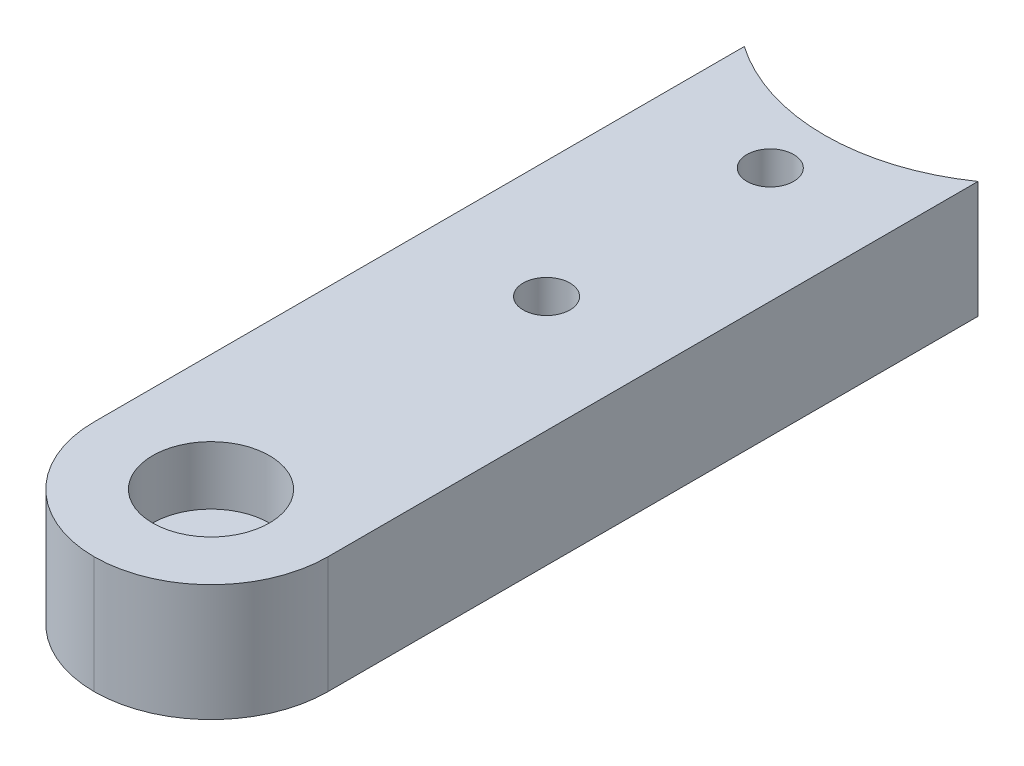
ISO-10303-21;
HEADER;
FILE_DESCRIPTION(('STEP AP214'),'2;1');
FILE_NAME('part.step','',(''),(''),'','','');
FILE_SCHEMA(('AUTOMOTIVE_DESIGN { 1 0 10303 214 1 1 1 1 }'));
ENDSEC;
DATA;
#1=APPLICATION_CONTEXT('core data for automotive mechanical design processes');
#2=APPLICATION_PROTOCOL_DEFINITION('international standard','automotive_design',2000,#1);
#3=PRODUCT_CONTEXT('',#1,'mechanical');
#4=PRODUCT('Part','Part','',(#3));
#5=PRODUCT_RELATED_PRODUCT_CATEGORY('part','',(#4));
#6=PRODUCT_DEFINITION_FORMATION('','',#4);
#7=PRODUCT_DEFINITION_CONTEXT('part definition',#1,'design');
#8=PRODUCT_DEFINITION('design','',#6,#7);
#9=PRODUCT_DEFINITION_SHAPE('','',#8);
#10=(LENGTH_UNIT() NAMED_UNIT(*) SI_UNIT(.MILLI.,.METRE.));
#11=(NAMED_UNIT(*) PLANE_ANGLE_UNIT() SI_UNIT($,.RADIAN.));
#12=(NAMED_UNIT(*) SI_UNIT($,.STERADIAN.) SOLID_ANGLE_UNIT());
#13=UNCERTAINTY_MEASURE_WITH_UNIT(LENGTH_MEASURE(1.E-05),#10,'distance_accuracy_value','');
#14=(GEOMETRIC_REPRESENTATION_CONTEXT(3) GLOBAL_UNCERTAINTY_ASSIGNED_CONTEXT((#13)) GLOBAL_UNIT_ASSIGNED_CONTEXT((#10,
#11,#12)) REPRESENTATION_CONTEXT('',''));
#15=CARTESIAN_POINT('',(0.,0.,0.));
#16=DIRECTION('',(0.,0.,1.));
#17=DIRECTION('',(1.,0.,0.));
#18=AXIS2_PLACEMENT_3D('',#15,#16,#17);
#19=CARTESIAN_POINT('',(2.,0.,13.));
#20=DIRECTION('',(0.,1.,0.));
#21=DIRECTION('',(0.,0.,1.));
#22=AXIS2_PLACEMENT_3D('',#19,#20,#21);
#23=CYLINDRICAL_SURFACE('',#22,0.4);
#24=CARTESIAN_POINT('',(2.,0.,13.));
#25=DIRECTION('',(0.,1.,0.));
#26=DIRECTION('',(0.,0.,1.));
#27=AXIS2_PLACEMENT_3D('',#24,#25,#26);
#28=CIRCLE('',#27,0.4);
#29=CARTESIAN_POINT('',(2.,0.,13.4));
#30=VERTEX_POINT('',#29);
#31=EDGE_CURVE('E155',#30,#30,#28,.T.);
#32=ORIENTED_EDGE('',*,*,#31,.F.);
#33=EDGE_LOOP('',(#32));
#34=FACE_BOUND('',#33,.T.);
#35=CARTESIAN_POINT('',(2.,1.,13.));
#36=DIRECTION('',(0.,1.,0.));
#37=DIRECTION('',(0.,0.,1.));
#38=AXIS2_PLACEMENT_3D('',#35,#36,#37);
#39=CIRCLE('',#38,0.4);
#40=CARTESIAN_POINT('',(2.,1.,13.4));
#41=VERTEX_POINT('',#40);
#42=EDGE_CURVE('E144',#41,#41,#39,.F.);
#43=ORIENTED_EDGE('',*,*,#42,.F.);
#44=EDGE_LOOP('',(#43));
#45=FACE_BOUND('',#44,.T.);
#46=ADVANCED_FACE('F43',(#34,#45),#23,.F.);
#47=CARTESIAN_POINT('',(4.,2.,0.));
#48=DIRECTION('',(1.,0.,0.));
#49=DIRECTION('',(0.,0.,-1.));
#50=AXIS2_PLACEMENT_3D('',#47,#48,#49);
#51=PLANE('',#50);
#52=DIRECTION('',(0.,0.,1.));
#53=VECTOR('',#52,1.);
#54=CARTESIAN_POINT('',(4.,2.,0.));
#55=LINE('',#54,#53);
#56=CARTESIAN_POINT('',(4.,2.,1.87228132326902));
#57=VERTEX_POINT('',#56);
#58=CARTESIAN_POINT('',(4.,2.,13.));
#59=VERTEX_POINT('',#58);
#60=EDGE_CURVE('E111',#57,#59,#55,.T.);
#61=ORIENTED_EDGE('',*,*,#60,.T.);
#62=DIRECTION('',(0.,-1.,0.));
#63=VECTOR('',#62,1.);
#64=CARTESIAN_POINT('',(4.,0.,13.));
#65=LINE('',#64,#63);
#66=CARTESIAN_POINT('',(4.,0.,13.));
#67=VERTEX_POINT('',#66);
#68=EDGE_CURVE('E101',#59,#67,#65,.T.);
#69=ORIENTED_EDGE('',*,*,#68,.T.);
#70=DIRECTION('',(0.,0.,1.));
#71=VECTOR('',#70,1.);
#72=CARTESIAN_POINT('',(4.,0.,0.));
#73=LINE('',#72,#71);
#74=CARTESIAN_POINT('',(4.,0.,1.87228132326902));
#75=VERTEX_POINT('',#74);
#76=EDGE_CURVE('E112',#75,#67,#73,.T.);
#77=ORIENTED_EDGE('',*,*,#76,.F.);
#78=DIRECTION('',(0.,1.,0.));
#79=VECTOR('',#78,1.);
#80=CARTESIAN_POINT('',(4.,0.,1.87228132326902));
#81=LINE('',#80,#79);
#82=EDGE_CURVE('E96',#57,#75,#81,.F.);
#83=ORIENTED_EDGE('',*,*,#82,.F.);
#84=EDGE_LOOP('',(#61,#69,#77,#83));
#85=FACE_BOUND('',#84,.T.);
#86=ADVANCED_FACE('F134',(#85),#51,.T.);
#87=CARTESIAN_POINT('',(0.,2.,0.));
#88=DIRECTION('',(1.,0.,0.));
#89=DIRECTION('',(0.,0.,-1.));
#90=AXIS2_PLACEMENT_3D('',#87,#88,#89);
#91=PLANE('',#90);
#92=DIRECTION('',(0.,0.,1.));
#93=VECTOR('',#92,1.);
#94=CARTESIAN_POINT('',(0.,0.,0.));
#95=LINE('',#94,#93);
#96=CARTESIAN_POINT('',(0.,0.,1.87228132326901));
#97=VERTEX_POINT('',#96);
#98=CARTESIAN_POINT('',(0.,0.,13.));
#99=VERTEX_POINT('',#98);
#100=EDGE_CURVE('E105',#97,#99,#95,.T.);
#101=ORIENTED_EDGE('',*,*,#100,.T.);
#102=DIRECTION('',(0.,-1.,0.));
#103=VECTOR('',#102,1.);
#104=CARTESIAN_POINT('',(0.,2.,13.));
#105=LINE('',#104,#103);
#106=CARTESIAN_POINT('',(0.,2.,13.));
#107=VERTEX_POINT('',#106);
#108=EDGE_CURVE('E12',#99,#107,#105,.F.);
#109=ORIENTED_EDGE('',*,*,#108,.T.);
#110=DIRECTION('',(0.,0.,1.));
#111=VECTOR('',#110,1.);
#112=CARTESIAN_POINT('',(0.,2.,0.));
#113=LINE('',#112,#111);
#114=CARTESIAN_POINT('',(0.,2.,1.87228132326901));
#115=VERTEX_POINT('',#114);
#116=EDGE_CURVE('E102',#115,#107,#113,.T.);
#117=ORIENTED_EDGE('',*,*,#116,.F.);
#118=DIRECTION('',(0.,1.,0.));
#119=VECTOR('',#118,1.);
#120=CARTESIAN_POINT('',(0.,0.,1.87228132326901));
#121=LINE('',#120,#119);
#122=EDGE_CURVE('E93',#115,#97,#121,.F.);
#123=ORIENTED_EDGE('',*,*,#122,.T.);
#124=EDGE_LOOP('',(#101,#109,#117,#123));
#125=FACE_BOUND('',#124,.T.);
#126=ADVANCED_FACE('F104',(#125),#91,.F.);
#127=CARTESIAN_POINT('',(0.,2.,0.));
#128=DIRECTION('',(0.,1.,0.));
#129=DIRECTION('',(0.,0.,1.));
#130=AXIS2_PLACEMENT_3D('',#127,#128,#129);
#131=PLANE('',#130);
#132=CARTESIAN_POINT('',(2.,2.,13.));
#133=DIRECTION('',(0.,1.,0.));
#134=DIRECTION('',(0.,0.,1.));
#135=AXIS2_PLACEMENT_3D('',#132,#133,#134);
#136=CIRCLE('',#135,2.);
#137=CARTESIAN_POINT('',(2.,2.,15.));
#138=VERTEX_POINT('',#137);
#139=EDGE_CURVE('E59',#107,#138,#136,.T.);
#140=ORIENTED_EDGE('',*,*,#139,.T.);
#141=CARTESIAN_POINT('',(2.,2.,13.));
#142=DIRECTION('',(0.,1.,0.));
#143=DIRECTION('',(0.,0.,1.));
#144=AXIS2_PLACEMENT_3D('',#141,#142,#143);
#145=CIRCLE('',#144,2.);
#146=EDGE_CURVE('E52',#138,#59,#145,.T.);
#147=ORIENTED_EDGE('',*,*,#146,.T.);
#148=ORIENTED_EDGE('',*,*,#60,.F.);
#149=CARTESIAN_POINT('',(2.,2.,-1.));
#150=DIRECTION('',(0.,1.,0.));
#151=DIRECTION('',(0.,0.,1.));
#152=AXIS2_PLACEMENT_3D('',#149,#150,#151);
#153=CIRCLE('',#152,3.5);
#154=EDGE_CURVE('E106',#115,#57,#153,.T.);
#155=ORIENTED_EDGE('',*,*,#154,.F.);
#156=ORIENTED_EDGE('',*,*,#116,.T.);
#157=EDGE_LOOP('',(#140,#147,#148,#155,#156));
#158=FACE_BOUND('',#157,.T.);
#159=CARTESIAN_POINT('',(2.,2.,13.));
#160=DIRECTION('',(0.,1.,0.));
#161=DIRECTION('',(0.,0.,1.));
#162=AXIS2_PLACEMENT_3D('',#159,#160,#161);
#163=CIRCLE('',#162,1.);
#164=CARTESIAN_POINT('',(2.,2.,14.));
#165=VERTEX_POINT('',#164);
#166=EDGE_CURVE('E140',#165,#165,#163,.T.);
#167=ORIENTED_EDGE('',*,*,#166,.F.);
#168=EDGE_LOOP('',(#167));
#169=FACE_BOUND('',#168,.T.);
#170=CARTESIAN_POINT('',(2.022495613113,2.,3.45002649493755));
#171=DIRECTION('',(0.,1.,0.));
#172=DIRECTION('',(0.,0.,1.));
#173=AXIS2_PLACEMENT_3D('',#170,#171,#172);
#174=CIRCLE('',#173,0.4);
#175=CARTESIAN_POINT('',(2.022495613113,2.,3.85002649493756));
#176=VERTEX_POINT('',#175);
#177=EDGE_CURVE('E152',#176,#176,#174,.T.);
#178=ORIENTED_EDGE('',*,*,#177,.F.);
#179=EDGE_LOOP('',(#178));
#180=FACE_BOUND('',#179,.T.);
#181=CARTESIAN_POINT('',(2.01349736786792,2.,7.27001589696245));
#182=DIRECTION('',(0.,1.,0.));
#183=DIRECTION('',(0.,0.,1.));
#184=AXIS2_PLACEMENT_3D('',#181,#182,#183);
#185=CIRCLE('',#184,0.4);
#186=CARTESIAN_POINT('',(2.01349736786792,2.,7.67001589696245));
#187=VERTEX_POINT('',#186);
#188=EDGE_CURVE('E158',#187,#187,#185,.T.);
#189=ORIENTED_EDGE('',*,*,#188,.F.);
#190=EDGE_LOOP('',(#189));
#191=FACE_BOUND('',#190,.T.);
#192=ADVANCED_FACE('F128',(#158,#169,#180,#191),#131,.T.);
#193=CARTESIAN_POINT('',(0.,0.,0.));
#194=DIRECTION('',(0.,1.,0.));
#195=DIRECTION('',(0.,0.,1.));
#196=AXIS2_PLACEMENT_3D('',#193,#194,#195);
#197=PLANE('',#196);
#198=CARTESIAN_POINT('',(2.022495613113,0.,3.45002649493755));
#199=DIRECTION('',(0.,1.,0.));
#200=DIRECTION('',(0.,0.,1.));
#201=AXIS2_PLACEMENT_3D('',#198,#199,#200);
#202=CIRCLE('',#201,0.4);
#203=CARTESIAN_POINT('',(2.022495613113,0.,3.85002649493756));
#204=VERTEX_POINT('',#203);
#205=EDGE_CURVE('E116',#204,#204,#202,.T.);
#206=ORIENTED_EDGE('',*,*,#205,.T.);
#207=EDGE_LOOP('',(#206));
#208=FACE_BOUND('',#207,.T.);
#209=ORIENTED_EDGE('',*,*,#31,.T.);
#210=EDGE_LOOP('',(#209));
#211=FACE_BOUND('',#210,.T.);
#212=CARTESIAN_POINT('',(2.01349736786792,0.,7.27001589696245));
#213=DIRECTION('',(0.,1.,0.));
#214=DIRECTION('',(0.,0.,1.));
#215=AXIS2_PLACEMENT_3D('',#212,#213,#214);
#216=CIRCLE('',#215,0.4);
#217=CARTESIAN_POINT('',(2.01349736786792,0.,7.67001589696245));
#218=VERTEX_POINT('',#217);
#219=EDGE_CURVE('E149',#218,#218,#216,.T.);
#220=ORIENTED_EDGE('',*,*,#219,.T.);
#221=EDGE_LOOP('',(#220));
#222=FACE_BOUND('',#221,.T.);
#223=ORIENTED_EDGE('',*,*,#76,.T.);
#224=CARTESIAN_POINT('',(2.,0.,13.));
#225=DIRECTION('',(0.,1.,0.));
#226=DIRECTION('',(0.,0.,1.));
#227=AXIS2_PLACEMENT_3D('',#224,#225,#226);
#228=CIRCLE('',#227,2.);
#229=CARTESIAN_POINT('',(2.,0.,15.));
#230=VERTEX_POINT('',#229);
#231=EDGE_CURVE('E123',#67,#230,#228,.F.);
#232=ORIENTED_EDGE('',*,*,#231,.T.);
#233=CARTESIAN_POINT('',(2.,0.,13.));
#234=DIRECTION('',(0.,1.,0.));
#235=DIRECTION('',(0.,0.,1.));
#236=AXIS2_PLACEMENT_3D('',#233,#234,#235);
#237=CIRCLE('',#236,2.);
#238=EDGE_CURVE('E110',#230,#99,#237,.F.);
#239=ORIENTED_EDGE('',*,*,#238,.T.);
#240=ORIENTED_EDGE('',*,*,#100,.F.);
#241=CARTESIAN_POINT('',(2.,0.,-1.));
#242=DIRECTION('',(0.,1.,0.));
#243=DIRECTION('',(0.,0.,1.));
#244=AXIS2_PLACEMENT_3D('',#241,#242,#243);
#245=CIRCLE('',#244,3.5);
#246=EDGE_CURVE('E90',#97,#75,#245,.T.);
#247=ORIENTED_EDGE('',*,*,#246,.T.);
#248=EDGE_LOOP('',(#223,#232,#239,#240,#247));
#249=FACE_BOUND('',#248,.T.);
#250=ADVANCED_FACE('F108',(#208,#211,#222,#249),#197,.F.);
#251=CARTESIAN_POINT('',(2.01349736786792,0.,7.27001589696245));
#252=DIRECTION('',(0.,1.,0.));
#253=DIRECTION('',(0.,0.,1.));
#254=AXIS2_PLACEMENT_3D('',#251,#252,#253);
#255=CYLINDRICAL_SURFACE('',#254,0.4);
#256=ORIENTED_EDGE('',*,*,#188,.T.);
#257=EDGE_LOOP('',(#256));
#258=FACE_BOUND('',#257,.T.);
#259=ORIENTED_EDGE('',*,*,#219,.F.);
#260=EDGE_LOOP('',(#259));
#261=FACE_BOUND('',#260,.T.);
#262=ADVANCED_FACE('F165',(#258,#261),#255,.F.);
#263=CARTESIAN_POINT('',(2.022495613113,0.,3.45002649493755));
#264=DIRECTION('',(0.,1.,0.));
#265=DIRECTION('',(0.,0.,1.));
#266=AXIS2_PLACEMENT_3D('',#263,#264,#265);
#267=CYLINDRICAL_SURFACE('',#266,0.4);
#268=ORIENTED_EDGE('',*,*,#177,.T.);
#269=EDGE_LOOP('',(#268));
#270=FACE_BOUND('',#269,.T.);
#271=ORIENTED_EDGE('',*,*,#205,.F.);
#272=EDGE_LOOP('',(#271));
#273=FACE_BOUND('',#272,.T.);
#274=ADVANCED_FACE('F167',(#270,#273),#267,.F.);
#275=CARTESIAN_POINT('',(2.,-2.82842712474619,13.));
#276=DIRECTION('',(0.,1.,0.));
#277=DIRECTION('',(0.,0.,1.));
#278=AXIS2_PLACEMENT_3D('',#275,#276,#277);
#279=CYLINDRICAL_SURFACE('',#278,1.);
#280=CARTESIAN_POINT('',(2.,1.,13.));
#281=DIRECTION('',(0.,1.,0.));
#282=DIRECTION('',(0.,0.,1.));
#283=AXIS2_PLACEMENT_3D('',#280,#281,#282);
#284=CIRCLE('',#283,1.);
#285=CARTESIAN_POINT('',(2.,1.,14.));
#286=VERTEX_POINT('',#285);
#287=EDGE_CURVE('E141',#286,#286,#284,.F.);
#288=ORIENTED_EDGE('',*,*,#287,.T.);
#289=EDGE_LOOP('',(#288));
#290=FACE_BOUND('',#289,.T.);
#291=ORIENTED_EDGE('',*,*,#166,.T.);
#292=EDGE_LOOP('',(#291));
#293=FACE_BOUND('',#292,.T.);
#294=ADVANCED_FACE('F174',(#290,#293),#279,.F.);
#295=CARTESIAN_POINT('',(0.,1.,0.));
#296=DIRECTION('',(0.,1.,0.));
#297=DIRECTION('',(0.,0.,1.));
#298=AXIS2_PLACEMENT_3D('',#295,#296,#297);
#299=PLANE('',#298);
#300=ORIENTED_EDGE('',*,*,#287,.F.);
#301=EDGE_LOOP('',(#300));
#302=FACE_BOUND('',#301,.T.);
#303=ORIENTED_EDGE('',*,*,#42,.T.);
#304=EDGE_LOOP('',(#303));
#305=FACE_BOUND('',#304,.T.);
#306=ADVANCED_FACE('F194',(#302,#305),#299,.T.);
#307=CARTESIAN_POINT('',(2.,0.,-1.));
#308=DIRECTION('',(0.,1.,0.));
#309=DIRECTION('',(0.,0.,1.));
#310=AXIS2_PLACEMENT_3D('',#307,#308,#309);
#311=CYLINDRICAL_SURFACE('',#310,3.5);
#312=ORIENTED_EDGE('',*,*,#82,.T.);
#313=ORIENTED_EDGE('',*,*,#246,.F.);
#314=ORIENTED_EDGE('',*,*,#122,.F.);
#315=ORIENTED_EDGE('',*,*,#154,.T.);
#316=EDGE_LOOP('',(#312,#313,#314,#315));
#317=FACE_BOUND('',#316,.T.);
#318=ADVANCED_FACE('F92',(#317),#311,.F.);
#319=CARTESIAN_POINT('',(2.,2.,13.));
#320=DIRECTION('',(0.,-1.,0.));
#321=DIRECTION('',(0.,0.,-1.));
#322=AXIS2_PLACEMENT_3D('',#319,#320,#321);
#323=CYLINDRICAL_SURFACE('',#322,2.);
#324=DIRECTION('',(0.,-1.,0.));
#325=VECTOR('',#324,1.);
#326=CARTESIAN_POINT('',(2.,2.,15.));
#327=LINE('',#326,#325);
#328=EDGE_CURVE('E47',#138,#230,#327,.T.);
#329=ORIENTED_EDGE('',*,*,#328,.F.);
#330=ORIENTED_EDGE('',*,*,#139,.F.);
#331=ORIENTED_EDGE('',*,*,#108,.F.);
#332=ORIENTED_EDGE('',*,*,#238,.F.);
#333=EDGE_LOOP('',(#329,#330,#331,#332));
#334=FACE_BOUND('',#333,.T.);
#335=ADVANCED_FACE('F45',(#334),#323,.T.);
#336=CARTESIAN_POINT('',(2.,2.,13.));
#337=DIRECTION('',(0.,1.,0.));
#338=DIRECTION('',(0.,0.,1.));
#339=AXIS2_PLACEMENT_3D('',#336,#337,#338);
#340=CYLINDRICAL_SURFACE('',#339,2.);
#341=ORIENTED_EDGE('',*,*,#146,.F.);
#342=ORIENTED_EDGE('',*,*,#328,.T.);
#343=ORIENTED_EDGE('',*,*,#231,.F.);
#344=ORIENTED_EDGE('',*,*,#68,.F.);
#345=EDGE_LOOP('',(#341,#342,#343,#344));
#346=FACE_BOUND('',#345,.T.);
#347=ADVANCED_FACE('F135',(#346),#340,.T.);
#348=CLOSED_SHELL('',(#46,#86,#126,#192,#250,#262,#274,#294,#306,#318,#335,#347));
#349=MANIFOLD_SOLID_BREP('B2',#348);
#350=ADVANCED_BREP_SHAPE_REPRESENTATION('',(#18,#349),#14);
#351=SHAPE_DEFINITION_REPRESENTATION(#9,#350);
ENDSEC;
END-ISO-10303-21;
